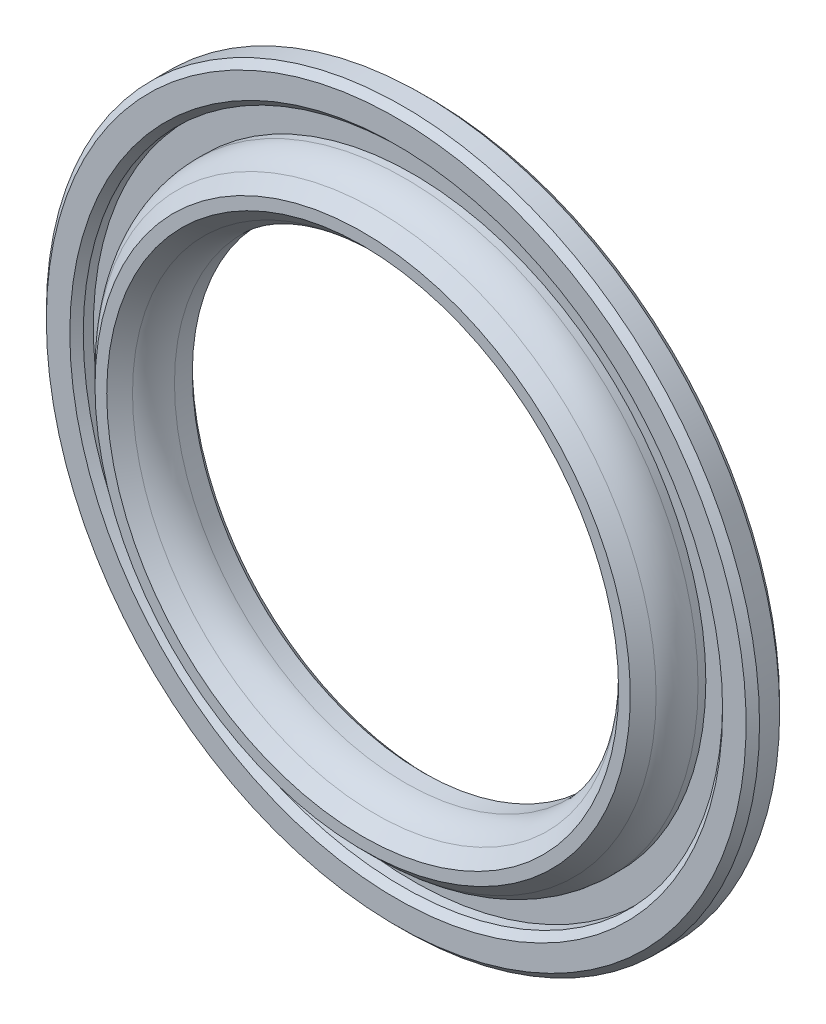
ISO-10303-21;
HEADER;
FILE_DESCRIPTION(('STEP AP214'),'2;1');
FILE_NAME('part.step','',(''),(''),'','','');
FILE_SCHEMA(('AUTOMOTIVE_DESIGN { 1 0 10303 214 1 1 1 1 }'));
ENDSEC;
DATA;
#1=APPLICATION_CONTEXT('core data for automotive mechanical design processes');
#2=APPLICATION_PROTOCOL_DEFINITION('international standard','automotive_design',2000,#1);
#3=PRODUCT_CONTEXT('',#1,'mechanical');
#4=PRODUCT('Part','Part','',(#3));
#5=PRODUCT_RELATED_PRODUCT_CATEGORY('part','',(#4));
#6=PRODUCT_DEFINITION_FORMATION('','',#4);
#7=PRODUCT_DEFINITION_CONTEXT('part definition',#1,'design');
#8=PRODUCT_DEFINITION('design','',#6,#7);
#9=PRODUCT_DEFINITION_SHAPE('','',#8);
#10=(LENGTH_UNIT() NAMED_UNIT(*) SI_UNIT(.MILLI.,.METRE.));
#11=(NAMED_UNIT(*) PLANE_ANGLE_UNIT() SI_UNIT($,.RADIAN.));
#12=(NAMED_UNIT(*) SI_UNIT($,.STERADIAN.) SOLID_ANGLE_UNIT());
#13=UNCERTAINTY_MEASURE_WITH_UNIT(LENGTH_MEASURE(1.E-05),#10,'distance_accuracy_value','');
#14=(GEOMETRIC_REPRESENTATION_CONTEXT(3) GLOBAL_UNCERTAINTY_ASSIGNED_CONTEXT((#13)) GLOBAL_UNIT_ASSIGNED_CONTEXT((#10,
#11,#12)) REPRESENTATION_CONTEXT('',''));
#15=CARTESIAN_POINT('',(0.,0.,0.));
#16=DIRECTION('',(0.,0.,1.));
#17=DIRECTION('',(1.,0.,0.));
#18=AXIS2_PLACEMENT_3D('',#15,#16,#17);
#19=CARTESIAN_POINT('',(0.,0.,28.0821917808219));
#20=DIRECTION('',(0.,0.,1.));
#21=DIRECTION('',(1.,0.,0.));
#22=AXIS2_PLACEMENT_3D('',#19,#20,#21);
#23=CYLINDRICAL_SURFACE('',#22,27.5);
#24=CARTESIAN_POINT('',(0.,0.,-5.07106781186546));
#25=DIRECTION('',(0.,0.,-1.));
#26=DIRECTION('',(-1.,0.,0.));
#27=AXIS2_PLACEMENT_3D('',#24,#25,#26);
#28=CIRCLE('',#27,27.5);
#29=CARTESIAN_POINT('',(-27.5,0.,-5.07106781186546));
#30=VERTEX_POINT('',#29);
#31=EDGE_CURVE('E40',#30,#30,#28,.F.);
#32=ORIENTED_EDGE('',*,*,#31,.T.);
#33=EDGE_LOOP('',(#32));
#34=FACE_BOUND('',#33,.T.);
#35=CARTESIAN_POINT('',(0.,0.,-7.19999999999998));
#36=DIRECTION('',(0.,0.,1.));
#37=DIRECTION('',(1.,0.,0.));
#38=AXIS2_PLACEMENT_3D('',#35,#36,#37);
#39=CIRCLE('',#38,27.5);
#40=CARTESIAN_POINT('',(27.5,0.,-7.19999999999998));
#41=VERTEX_POINT('',#40);
#42=EDGE_CURVE('E74',#41,#41,#39,.F.);
#43=ORIENTED_EDGE('',*,*,#42,.T.);
#44=EDGE_LOOP('',(#43));
#45=FACE_BOUND('',#44,.T.);
#46=ADVANCED_FACE('F33',(#34,#45),#23,.F.);
#47=CARTESIAN_POINT('',(0.,27.5,0.));
#48=DIRECTION('',(0.,0.,-1.));
#49=DIRECTION('',(-1.,0.,0.));
#50=AXIS2_PLACEMENT_3D('',#47,#48,#49);
#51=PLANE('',#50);
#52=CARTESIAN_POINT('',(0.,0.,0.));
#53=DIRECTION('',(0.,0.,-1.));
#54=DIRECTION('',(-1.,0.,0.));
#55=AXIS2_PLACEMENT_3D('',#52,#53,#54);
#56=CIRCLE('',#55,31.9);
#57=CARTESIAN_POINT('',(-31.9,0.,0.));
#58=VERTEX_POINT('',#57);
#59=EDGE_CURVE('E53',#58,#58,#56,.F.);
#60=ORIENTED_EDGE('',*,*,#59,.T.);
#61=EDGE_LOOP('',(#60));
#62=FACE_BOUND('',#61,.T.);
#63=CARTESIAN_POINT('',(0.,0.,0.));
#64=DIRECTION('',(0.,0.,-1.));
#65=DIRECTION('',(-1.,0.,0.));
#66=AXIS2_PLACEMENT_3D('',#63,#64,#65);
#67=CIRCLE('',#66,30.5);
#68=CARTESIAN_POINT('',(-30.5,0.,0.));
#69=VERTEX_POINT('',#68);
#70=EDGE_CURVE('E56',#69,#69,#67,.T.);
#71=ORIENTED_EDGE('',*,*,#70,.T.);
#72=EDGE_LOOP('',(#71));
#73=FACE_BOUND('',#72,.T.);
#74=ADVANCED_FACE('F108',(#62,#73),#51,.F.);
#75=CARTESIAN_POINT('',(0.,0.,28.0821917808219));
#76=DIRECTION('',(0.,0.,1.));
#77=DIRECTION('',(1.,0.,0.));
#78=AXIS2_PLACEMENT_3D('',#75,#76,#77);
#79=CYLINDRICAL_SURFACE('',#78,34.9);
#80=CARTESIAN_POINT('',(0.,0.,-5.07106781186549));
#81=DIRECTION('',(0.,0.,1.));
#82=DIRECTION('',(1.,0.,0.));
#83=AXIS2_PLACEMENT_3D('',#80,#81,#82);
#84=CIRCLE('',#83,34.9);
#85=CARTESIAN_POINT('',(34.9,0.,-5.07106781186549));
#86=VERTEX_POINT('',#85);
#87=EDGE_CURVE('E48',#86,#86,#84,.F.);
#88=ORIENTED_EDGE('',*,*,#87,.T.);
#89=EDGE_LOOP('',(#88));
#90=FACE_BOUND('',#89,.T.);
#91=CARTESIAN_POINT('',(0.,0.,-6.));
#92=DIRECTION('',(0.,0.,1.));
#93=DIRECTION('',(1.,0.,0.));
#94=AXIS2_PLACEMENT_3D('',#91,#92,#93);
#95=CIRCLE('',#94,34.9);
#96=CARTESIAN_POINT('',(34.9,0.,-6.));
#97=VERTEX_POINT('',#96);
#98=EDGE_CURVE('E83',#97,#97,#95,.T.);
#99=ORIENTED_EDGE('',*,*,#98,.T.);
#100=EDGE_LOOP('',(#99));
#101=FACE_BOUND('',#100,.T.);
#102=ADVANCED_FACE('F104',(#90,#101),#79,.T.);
#103=CARTESIAN_POINT('',(0.,34.9,-6.));
#104=DIRECTION('',(0.,0.,-1.));
#105=DIRECTION('',(-1.,0.,0.));
#106=AXIS2_PLACEMENT_3D('',#103,#104,#105);
#107=PLANE('',#106);
#108=ORIENTED_EDGE('',*,*,#98,.F.);
#109=EDGE_LOOP('',(#108));
#110=FACE_BOUND('',#109,.T.);
#111=CARTESIAN_POINT('',(0.,0.,-6.));
#112=DIRECTION('',(0.,0.,1.));
#113=DIRECTION('',(1.,0.,0.));
#114=AXIS2_PLACEMENT_3D('',#111,#112,#113);
#115=CIRCLE('',#114,38.1);
#116=CARTESIAN_POINT('',(38.1,0.,-6.));
#117=VERTEX_POINT('',#116);
#118=EDGE_CURVE('E86',#117,#117,#115,.T.);
#119=ORIENTED_EDGE('',*,*,#118,.T.);
#120=EDGE_LOOP('',(#119));
#121=FACE_BOUND('',#120,.T.);
#122=ADVANCED_FACE('F90',(#110,#121),#107,.F.);
#123=CARTESIAN_POINT('',(0.,0.,28.0821917808219));
#124=DIRECTION('',(0.,0.,1.));
#125=DIRECTION('',(1.,0.,0.));
#126=AXIS2_PLACEMENT_3D('',#123,#124,#125);
#127=CYLINDRICAL_SURFACE('',#126,38.1);
#128=CARTESIAN_POINT('',(0.,0.,-4.80000000000003));
#129=DIRECTION('',(0.,0.,-1.));
#130=DIRECTION('',(-1.,0.,0.));
#131=AXIS2_PLACEMENT_3D('',#128,#129,#130);
#132=CIRCLE('',#131,38.1);
#133=CARTESIAN_POINT('',(-38.1,0.,-4.80000000000003));
#134=VERTEX_POINT('',#133);
#135=EDGE_CURVE('E59',#134,#134,#132,.F.);
#136=ORIENTED_EDGE('',*,*,#135,.T.);
#137=EDGE_LOOP('',(#136));
#138=FACE_BOUND('',#137,.T.);
#139=ORIENTED_EDGE('',*,*,#118,.F.);
#140=EDGE_LOOP('',(#139));
#141=FACE_BOUND('',#140,.T.);
#142=ADVANCED_FACE('F92',(#138,#141),#127,.F.);
#143=CARTESIAN_POINT('',(0.,38.1,-4.));
#144=DIRECTION('',(0.,0.,-1.));
#145=DIRECTION('',(-1.,0.,0.));
#146=AXIS2_PLACEMENT_3D('',#143,#144,#145);
#147=PLANE('',#146);
#148=CARTESIAN_POINT('',(0.,0.,-4.));
#149=DIRECTION('',(0.,0.,-1.));
#150=DIRECTION('',(-1.,0.,0.));
#151=AXIS2_PLACEMENT_3D('',#148,#149,#150);
#152=CIRCLE('',#151,41.7);
#153=CARTESIAN_POINT('',(-41.7,0.,-4.));
#154=VERTEX_POINT('',#153);
#155=EDGE_CURVE('E62',#154,#154,#152,.F.);
#156=ORIENTED_EDGE('',*,*,#155,.T.);
#157=EDGE_LOOP('',(#156));
#158=FACE_BOUND('',#157,.T.);
#159=CARTESIAN_POINT('',(0.,0.,-4.));
#160=DIRECTION('',(0.,0.,-1.));
#161=DIRECTION('',(-1.,0.,0.));
#162=AXIS2_PLACEMENT_3D('',#159,#160,#161);
#163=CIRCLE('',#162,38.9);
#164=CARTESIAN_POINT('',(-38.9,0.,-4.));
#165=VERTEX_POINT('',#164);
#166=EDGE_CURVE('E65',#165,#165,#163,.T.);
#167=ORIENTED_EDGE('',*,*,#166,.T.);
#168=EDGE_LOOP('',(#167));
#169=FACE_BOUND('',#168,.T.);
#170=ADVANCED_FACE('F94',(#158,#169),#147,.F.);
#171=CARTESIAN_POINT('',(0.,0.,28.0821917808219));
#172=DIRECTION('',(0.,0.,1.));
#173=DIRECTION('',(1.,0.,0.));
#174=AXIS2_PLACEMENT_3D('',#171,#172,#173);
#175=CYLINDRICAL_SURFACE('',#174,42.5);
#176=CARTESIAN_POINT('',(0.,0.,-7.20000000000002));
#177=DIRECTION('',(0.,0.,1.));
#178=DIRECTION('',(1.,0.,0.));
#179=AXIS2_PLACEMENT_3D('',#176,#177,#178);
#180=CIRCLE('',#179,42.5);
#181=CARTESIAN_POINT('',(42.5,0.,-7.20000000000002));
#182=VERTEX_POINT('',#181);
#183=EDGE_CURVE('E68',#182,#182,#180,.T.);
#184=ORIENTED_EDGE('',*,*,#183,.T.);
#185=EDGE_LOOP('',(#184));
#186=FACE_BOUND('',#185,.T.);
#187=CARTESIAN_POINT('',(0.,0.,-4.79999999999996));
#188=DIRECTION('',(0.,0.,-1.));
#189=DIRECTION('',(-1.,0.,0.));
#190=AXIS2_PLACEMENT_3D('',#187,#188,#189);
#191=CIRCLE('',#190,42.5);
#192=CARTESIAN_POINT('',(-42.5,0.,-4.79999999999996));
#193=VERTEX_POINT('',#192);
#194=EDGE_CURVE('E71',#193,#193,#191,.T.);
#195=ORIENTED_EDGE('',*,*,#194,.T.);
#196=EDGE_LOOP('',(#195));
#197=FACE_BOUND('',#196,.T.);
#198=ADVANCED_FACE('F101',(#186,#197),#175,.T.);
#199=CARTESIAN_POINT('',(0.,42.5,-8.));
#200=DIRECTION('',(0.,0.,1.));
#201=DIRECTION('',(1.,0.,0.));
#202=AXIS2_PLACEMENT_3D('',#199,#200,#201);
#203=PLANE('',#202);
#204=CARTESIAN_POINT('',(0.,0.,-8.));
#205=DIRECTION('',(0.,0.,1.));
#206=DIRECTION('',(1.,0.,0.));
#207=AXIS2_PLACEMENT_3D('',#204,#205,#206);
#208=CIRCLE('',#207,28.3);
#209=CARTESIAN_POINT('',(28.3,0.,-8.));
#210=VERTEX_POINT('',#209);
#211=EDGE_CURVE('E77',#210,#210,#208,.T.);
#212=ORIENTED_EDGE('',*,*,#211,.T.);
#213=EDGE_LOOP('',(#212));
#214=FACE_BOUND('',#213,.T.);
#215=CARTESIAN_POINT('',(0.,0.,-8.));
#216=DIRECTION('',(0.,0.,1.));
#217=DIRECTION('',(1.,0.,0.));
#218=AXIS2_PLACEMENT_3D('',#215,#216,#217);
#219=CIRCLE('',#218,41.7);
#220=CARTESIAN_POINT('',(41.7,0.,-8.));
#221=VERTEX_POINT('',#220);
#222=EDGE_CURVE('E80',#221,#221,#219,.F.);
#223=ORIENTED_EDGE('',*,*,#222,.T.);
#224=EDGE_LOOP('',(#223));
#225=FACE_BOUND('',#224,.T.);
#226=ADVANCED_FACE('F126',(#214,#225),#203,.F.);
#227=CARTESIAN_POINT('',(0.,0.,-8.));
#228=DIRECTION('',(0.,0.,-1.));
#229=DIRECTION('',(-1.,0.,0.));
#230=AXIS2_PLACEMENT_3D('',#227,#228,#229);
#231=CONICAL_SURFACE('',#230,28.3,0.785398163397442);
#232=ORIENTED_EDGE('',*,*,#42,.F.);
#233=EDGE_LOOP('',(#232));
#234=FACE_BOUND('',#233,.T.);
#235=ORIENTED_EDGE('',*,*,#211,.F.);
#236=EDGE_LOOP('',(#235));
#237=FACE_BOUND('',#236,.T.);
#238=ADVANCED_FACE('F119',(#234,#237),#231,.F.);
#239=CARTESIAN_POINT('',(0.,0.,-7.20000000000002));
#240=DIRECTION('',(0.,0.,1.));
#241=DIRECTION('',(1.,0.,0.));
#242=AXIS2_PLACEMENT_3D('',#239,#240,#241);
#243=CONICAL_SURFACE('',#242,42.5,0.785398163397448);
#244=ORIENTED_EDGE('',*,*,#222,.F.);
#245=EDGE_LOOP('',(#244));
#246=FACE_BOUND('',#245,.T.);
#247=ORIENTED_EDGE('',*,*,#183,.F.);
#248=EDGE_LOOP('',(#247));
#249=FACE_BOUND('',#248,.T.);
#250=ADVANCED_FACE('F125',(#246,#249),#243,.T.);
#251=CARTESIAN_POINT('',(0.,0.,-4.));
#252=DIRECTION('',(0.,0.,-1.));
#253=DIRECTION('',(-1.,0.,0.));
#254=AXIS2_PLACEMENT_3D('',#251,#252,#253);
#255=CONICAL_SURFACE('',#254,41.7,0.785398163397457);
#256=ORIENTED_EDGE('',*,*,#194,.F.);
#257=EDGE_LOOP('',(#256));
#258=FACE_BOUND('',#257,.T.);
#259=ORIENTED_EDGE('',*,*,#155,.F.);
#260=EDGE_LOOP('',(#259));
#261=FACE_BOUND('',#260,.T.);
#262=ADVANCED_FACE('F133',(#258,#261),#255,.T.);
#263=CARTESIAN_POINT('',(0.,0.,-4.80000000000003));
#264=DIRECTION('',(0.,0.,1.));
#265=DIRECTION('',(1.,0.,0.));
#266=AXIS2_PLACEMENT_3D('',#263,#264,#265);
#267=CONICAL_SURFACE('',#266,38.1,0.785398163397444);
#268=ORIENTED_EDGE('',*,*,#166,.F.);
#269=EDGE_LOOP('',(#268));
#270=FACE_BOUND('',#269,.T.);
#271=ORIENTED_EDGE('',*,*,#135,.F.);
#272=EDGE_LOOP('',(#271));
#273=FACE_BOUND('',#272,.T.);
#274=ADVANCED_FACE('F140',(#270,#273),#267,.F.);
#275=CARTESIAN_POINT('',(0.,0.,0.));
#276=DIRECTION('',(0.,0.,-1.));
#277=DIRECTION('',(-1.,0.,0.));
#278=AXIS2_PLACEMENT_3D('',#275,#276,#277);
#279=CONICAL_SURFACE('',#278,31.9,0.785398163397445);
#280=CARTESIAN_POINT('',(0.,0.,-1.53553390593276));
#281=DIRECTION('',(0.,0.,-1.));
#282=DIRECTION('',(-1.,0.,0.));
#283=AXIS2_PLACEMENT_3D('',#280,#281,#282);
#284=CIRCLE('',#283,33.4355339059328);
#285=CARTESIAN_POINT('',(-33.4355339059327,0.,-1.53553390593276));
#286=VERTEX_POINT('',#285);
#287=EDGE_CURVE('E44',#286,#286,#284,.F.);
#288=CARTESIAN_POINT('',(-33.4355339059327,0.,-1.53553390593276));
#289=CARTESIAN_POINT('',(-33.4195387610793,0.,-1.51953876107929));
#290=CARTESIAN_POINT('',(-33.4035436162258,0.,-1.50354361622582));
#291=CARTESIAN_POINT('',(-33.3715533265189,0.,-1.47155332651889));
#292=CARTESIAN_POINT('',(-33.3555581816654,0.,-1.45555818166543));
#293=CARTESIAN_POINT('',(-33.3235678919585,0.,-1.42356789195849));
#294=CARTESIAN_POINT('',(-33.307572747105,0.,-1.40757274710503));
#295=CARTESIAN_POINT('',(-33.2755824573981,0.,-1.3755824573981));
#296=CARTESIAN_POINT('',(-33.2595873125446,0.,-1.35958731254463));
#297=CARTESIAN_POINT('',(-33.2275970228377,0.,-1.3275970228377));
#298=CARTESIAN_POINT('',(-33.2116018779842,0.,-1.31160187798423));
#299=CARTESIAN_POINT('',(-33.1796115882773,0.,-1.2796115882773));
#300=CARTESIAN_POINT('',(-33.1636164434238,0.,-1.26361644342383));
#301=CARTESIAN_POINT('',(-33.1316261537169,0.,-1.2316261537169));
#302=CARTESIAN_POINT('',(-33.1156310088634,0.,-1.21563100886343));
#303=CARTESIAN_POINT('',(-33.0836407191565,0.,-1.1836407191565));
#304=CARTESIAN_POINT('',(-33.067645574303,0.,-1.16764557430303));
#305=CARTESIAN_POINT('',(-33.0356552845961,0.,-1.1356552845961));
#306=CARTESIAN_POINT('',(-33.0196601397426,0.,-1.11966013974264));
#307=CARTESIAN_POINT('',(-32.9876698500357,0.,-1.0876698500357));
#308=CARTESIAN_POINT('',(-32.9716747051822,0.,-1.07167470518224));
#309=CARTESIAN_POINT('',(-32.9396844154753,0.,-1.0396844154753));
#310=CARTESIAN_POINT('',(-32.9236892706218,0.,-1.02368927062184));
#311=CARTESIAN_POINT('',(-32.8916989809149,0.,-0.991698980914907));
#312=CARTESIAN_POINT('',(-32.8757038360614,0.,-0.975703836061439));
#313=CARTESIAN_POINT('',(-32.8437135463545,0.,-0.943713546354507));
#314=CARTESIAN_POINT('',(-32.827718401501,0.,-0.927718401501042));
#315=CARTESIAN_POINT('',(-32.7957281117941,0.,-0.895728111794109));
#316=CARTESIAN_POINT('',(-32.7797329669406,0.,-0.879732966940642));
#317=CARTESIAN_POINT('',(-32.7477426772337,0.,-0.84774267723371));
#318=CARTESIAN_POINT('',(-32.7317475323802,0.,-0.831747532380244));
#319=CARTESIAN_POINT('',(-32.6997572426733,0.,-0.799757242673312));
#320=CARTESIAN_POINT('',(-32.6837620978198,0.,-0.783762097819845));
#321=CARTESIAN_POINT('',(-32.6517718081129,0.,-0.751771808112912));
#322=CARTESIAN_POINT('',(-32.6357766632594,0.,-0.735776663259447));
#323=CARTESIAN_POINT('',(-32.6037863735525,0.,-0.703786373552514));
#324=CARTESIAN_POINT('',(-32.587791228699,0.,-0.687791228699047));
#325=CARTESIAN_POINT('',(-32.5558009389921,0.,-0.655800938992115));
#326=CARTESIAN_POINT('',(-32.5398057941386,0.,-0.63980579413865));
#327=CARTESIAN_POINT('',(-32.5078155044317,0.,-0.607815504431717));
#328=CARTESIAN_POINT('',(-32.4918203595782,0.,-0.59182035957825));
#329=CARTESIAN_POINT('',(-32.4598300698713,0.,-0.559830069871317));
#330=CARTESIAN_POINT('',(-32.4438349250178,0.,-0.543834925017852));
#331=CARTESIAN_POINT('',(-32.4118446353109,0.,-0.51184463531092));
#332=CARTESIAN_POINT('',(-32.3958494904575,0.,-0.495849490457452));
#333=CARTESIAN_POINT('',(-32.3638592007505,0.,-0.46385920075052));
#334=CARTESIAN_POINT('',(-32.347864055897,0.,-0.447864055897055));
#335=CARTESIAN_POINT('',(-32.3158737661901,0.,-0.415873766190123));
#336=CARTESIAN_POINT('',(-32.2998786213367,0.,-0.399878621336655));
#337=CARTESIAN_POINT('',(-32.2678883316297,0.,-0.367888331629723));
#338=CARTESIAN_POINT('',(-32.2518931867763,0.,-0.351893186776258));
#339=CARTESIAN_POINT('',(-32.2199028970693,0.,-0.319902897069325));
#340=CARTESIAN_POINT('',(-32.2039077522159,0.,-0.303907752215858));
#341=CARTESIAN_POINT('',(-32.1719174625089,0.,-0.271917462508925));
#342=CARTESIAN_POINT('',(-32.1559223176555,0.,-0.25592231765546));
#343=CARTESIAN_POINT('',(-32.1239320279485,0.,-0.223932027948528));
#344=CARTESIAN_POINT('',(-32.1079368830951,0.,-0.20793688309506));
#345=CARTESIAN_POINT('',(-32.0759465933881,0.,-0.175946593388128));
#346=CARTESIAN_POINT('',(-32.0599514485347,0.,-0.159951448534663));
#347=CARTESIAN_POINT('',(-32.0279611588277,0.,-0.12796115882773));
#348=CARTESIAN_POINT('',(-32.0119660139743,0.,-0.111966013974263));
#349=CARTESIAN_POINT('',(-31.9799757242673,0.,-0.0799757242673304));
#350=CARTESIAN_POINT('',(-31.9639805794139,0.,-0.0639805794138648));
#351=CARTESIAN_POINT('',(-31.9319902897069,0.,-0.0319902897069337));
#352=CARTESIAN_POINT('',(-31.9159951448535,0.,-0.0159951448534681));
#353=CARTESIAN_POINT('',(-31.9,0.,0.));
#354=B_SPLINE_CURVE_WITH_KNOTS('',3,(#288,#289,#290,#291,#292,#293,#294,#295,#296,#297,#298,
#299,#300,#301,#302,#303,#304,#305,#306,#307,#308,#309,#310,#311,#312,#313,#314,#315,#316,#317,
#318,#319,#320,#321,#322,#323,#324,#325,#326,#327,#328,#329,#330,#331,#332,#333,#334,#335,#336,
#337,#338,#339,#340,#341,#342,#343,#344,#345,#346,#347,#348,#349,#350,#351,#352,#353),
.UNSPECIFIED.,.F.,.F.,(4,2,2,2,2,2,2,2,2,2,2,2,2,2,2,2,2,2,2,2,2,2,2,2,2,2,2,2,2,2,2,2,4),(0.,
0.0678616523516798,0.135723304703365,0.203584957055044,0.271446609406724,0.339308261758409,
0.407169914110089,0.475031566461774,0.542893218813454,0.610754871165138,0.678616523516818,
0.746478175868503,0.814339828220182,0.882201480571867,0.950063132923547,1.01792478527523,
1.08578643762691,1.1536480899786,1.22150974233028,1.28937139468196,1.35723304703364,
1.42509469938533,1.49295635173701,1.56081800408869,1.62867965644037,1.69654130879206,
1.76440296114374,1.83226461349542,1.9001262658471,1.96798791819878,2.03584957055046,
2.10371122290215,2.17157287525383),.UNSPECIFIED.);
#355=EDGE_CURVE('BSEAM147',#286,#58,#354,.T.);
#356=ORIENTED_EDGE('',*,*,#287,.T.);
#357=ORIENTED_EDGE('',*,*,#59,.F.);
#358=ORIENTED_EDGE('',*,*,#355,.T.);
#359=ORIENTED_EDGE('',*,*,#355,.F.);
#360=EDGE_LOOP('',(#356,#358,#357,#359));
#361=FACE_BOUND('',#360,.T.);
#362=ADVANCED_FACE('F147',(#361),#279,.T.);
#363=CARTESIAN_POINT('',(0.,0.,-2.99999999999998));
#364=DIRECTION('',(0.,0.,1.));
#365=DIRECTION('',(1.,0.,0.));
#366=AXIS2_PLACEMENT_3D('',#363,#364,#365);
#367=CONICAL_SURFACE('',#366,27.5,0.785398163397451);
#368=CARTESIAN_POINT('',(0.,0.,-1.53553390593272));
#369=DIRECTION('',(0.,0.,1.));
#370=DIRECTION('',(1.,0.,0.));
#371=AXIS2_PLACEMENT_3D('',#368,#369,#370);
#372=CIRCLE('',#371,28.9644660940673);
#373=CARTESIAN_POINT('',(28.9644660940673,0.,-1.53553390593272));
#374=VERTEX_POINT('',#373);
#375=EDGE_CURVE('E10',#374,#374,#372,.F.);
#376=ORIENTED_EDGE('',*,*,#375,.T.);
#377=EDGE_LOOP('',(#376));
#378=FACE_BOUND('',#377,.T.);
#379=ORIENTED_EDGE('',*,*,#70,.F.);
#380=EDGE_LOOP('',(#379));
#381=FACE_BOUND('',#380,.T.);
#382=ADVANCED_FACE('F154',(#378,#381),#367,.F.);
#383=CARTESIAN_POINT('',(0.,0.,-5.07106781186549));
#384=DIRECTION('',(0.,0.,1.));
#385=DIRECTION('',(1.,0.,0.));
#386=AXIS2_PLACEMENT_3D('',#383,#384,#385);
#387=TOROIDAL_SURFACE('',#386,29.9,5.);
#388=ORIENTED_EDGE('',*,*,#287,.F.);
#389=EDGE_LOOP('',(#388));
#390=FACE_BOUND('',#389,.T.);
#391=ORIENTED_EDGE('',*,*,#87,.F.);
#392=EDGE_LOOP('',(#391));
#393=FACE_BOUND('',#392,.T.);
#394=ADVANCED_FACE('F159',(#390,#393),#387,.T.);
#395=CARTESIAN_POINT('',(0.,0.,-5.07106781186546));
#396=DIRECTION('',(0.,0.,-1.));
#397=DIRECTION('',(-1.,0.,0.));
#398=AXIS2_PLACEMENT_3D('',#395,#396,#397);
#399=TOROIDAL_SURFACE('',#398,32.5,5.);
#400=ORIENTED_EDGE('',*,*,#375,.F.);
#401=EDGE_LOOP('',(#400));
#402=FACE_BOUND('',#401,.T.);
#403=ORIENTED_EDGE('',*,*,#31,.F.);
#404=EDGE_LOOP('',(#403));
#405=FACE_BOUND('',#404,.T.);
#406=ADVANCED_FACE('F35',(#402,#405),#399,.T.);
#407=CLOSED_SHELL('',(#46,#74,#102,#122,#142,#170,#198,#226,#238,#250,#262,#274,#362,#382,#394,#406));
#408=MANIFOLD_SOLID_BREP('B2',#407);
#409=ADVANCED_BREP_SHAPE_REPRESENTATION('',(#18,#408),#14);
#410=SHAPE_DEFINITION_REPRESENTATION(#9,#409);
ENDSEC;
END-ISO-10303-21;
